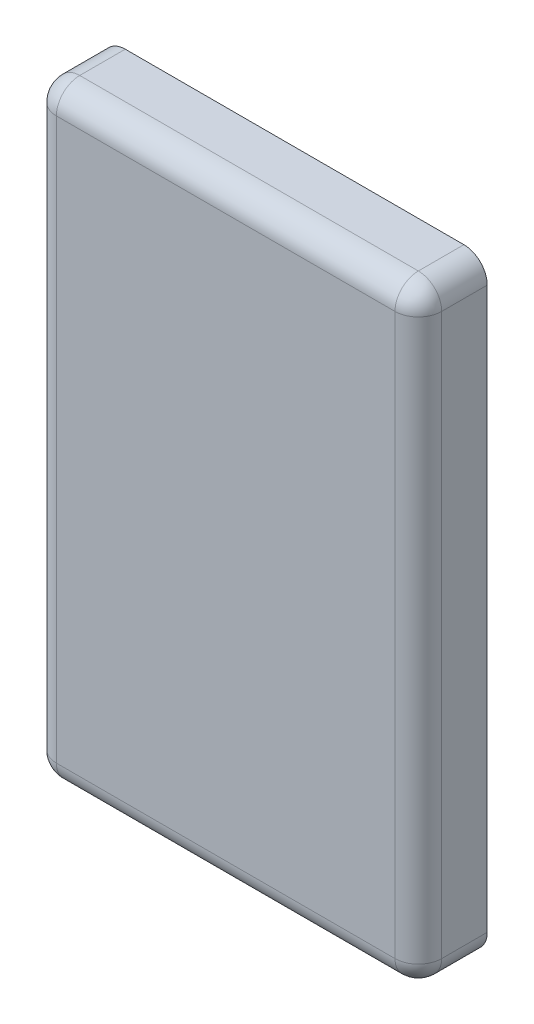
ISO-10303-21;
HEADER;
FILE_DESCRIPTION(('STEP AP214'),'2;1');
FILE_NAME('part.step','',(''),(''),'','','');
FILE_SCHEMA(('AUTOMOTIVE_DESIGN { 1 0 10303 214 1 1 1 1 }'));
ENDSEC;
DATA;
#1=APPLICATION_CONTEXT('core data for automotive mechanical design processes');
#2=APPLICATION_PROTOCOL_DEFINITION('international standard','automotive_design',2000,#1);
#3=PRODUCT_CONTEXT('',#1,'mechanical');
#4=PRODUCT('Part','Part','',(#3));
#5=PRODUCT_RELATED_PRODUCT_CATEGORY('part','',(#4));
#6=PRODUCT_DEFINITION_FORMATION('','',#4);
#7=PRODUCT_DEFINITION_CONTEXT('part definition',#1,'design');
#8=PRODUCT_DEFINITION('design','',#6,#7);
#9=PRODUCT_DEFINITION_SHAPE('','',#8);
#10=(LENGTH_UNIT() NAMED_UNIT(*) SI_UNIT(.MILLI.,.METRE.));
#11=(NAMED_UNIT(*) PLANE_ANGLE_UNIT() SI_UNIT($,.RADIAN.));
#12=(NAMED_UNIT(*) SI_UNIT($,.STERADIAN.) SOLID_ANGLE_UNIT());
#13=UNCERTAINTY_MEASURE_WITH_UNIT(LENGTH_MEASURE(1.E-05),#10,'distance_accuracy_value','');
#14=(GEOMETRIC_REPRESENTATION_CONTEXT(3) GLOBAL_UNCERTAINTY_ASSIGNED_CONTEXT((#13)) GLOBAL_UNIT_ASSIGNED_CONTEXT((#10,
#11,#12)) REPRESENTATION_CONTEXT('',''));
#15=CARTESIAN_POINT('',(0.,0.,0.));
#16=DIRECTION('',(0.,0.,1.));
#17=DIRECTION('',(1.,0.,0.));
#18=AXIS2_PLACEMENT_3D('',#15,#16,#17);
#19=CARTESIAN_POINT('',(165.,260.,9.));
#20=DIRECTION('',(0.,-1.,0.));
#21=DIRECTION('',(0.,0.,-1.));
#22=AXIS2_PLACEMENT_3D('',#19,#20,#21);
#23=PLANE('',#22);
#24=DIRECTION('',(-1.,0.,0.));
#25=VECTOR('',#24,1.);
#26=CARTESIAN_POINT('',(165.,260.,0.));
#27=LINE('',#26,#25);
#28=CARTESIAN_POINT('',(145.,260.,0.));
#29=VERTEX_POINT('',#28);
#30=CARTESIAN_POINT('',(-145.,260.,0.));
#31=VERTEX_POINT('',#30);
#32=EDGE_CURVE('E149',#29,#31,#27,.T.);
#33=ORIENTED_EDGE('',*,*,#32,.T.);
#34=DIRECTION('',(0.,0.,-1.));
#35=VECTOR('',#34,1.);
#36=CARTESIAN_POINT('',(-145.,260.,9.));
#37=LINE('',#36,#35);
#38=CARTESIAN_POINT('',(-145.,260.,39.));
#39=VERTEX_POINT('',#38);
#40=EDGE_CURVE('E170',#31,#39,#37,.F.);
#41=ORIENTED_EDGE('',*,*,#40,.T.);
#42=DIRECTION('',(-1.,0.,0.));
#43=VECTOR('',#42,1.);
#44=CARTESIAN_POINT('',(165.,260.,39.));
#45=LINE('',#44,#43);
#46=CARTESIAN_POINT('',(145.,260.,39.));
#47=VERTEX_POINT('',#46);
#48=EDGE_CURVE('E164',#39,#47,#45,.F.);
#49=ORIENTED_EDGE('',*,*,#48,.T.);
#50=DIRECTION('',(0.,0.,-1.));
#51=VECTOR('',#50,1.);
#52=CARTESIAN_POINT('',(145.,260.,9.));
#53=LINE('',#52,#51);
#54=EDGE_CURVE('E162',#47,#29,#53,.T.);
#55=ORIENTED_EDGE('',*,*,#54,.T.);
#56=EDGE_LOOP('',(#33,#41,#49,#55));
#57=FACE_BOUND('',#56,.T.);
#58=ADVANCED_FACE('F41',(#57),#23,.F.);
#59=CARTESIAN_POINT('',(-165.,-260.,9.));
#60=DIRECTION('',(1.,0.,0.));
#61=DIRECTION('',(0.,0.,-1.));
#62=AXIS2_PLACEMENT_3D('',#59,#60,#61);
#63=PLANE('',#62);
#64=DIRECTION('',(0.,-1.,0.));
#65=VECTOR('',#64,1.);
#66=CARTESIAN_POINT('',(-165.,-260.,0.));
#67=LINE('',#66,#65);
#68=CARTESIAN_POINT('',(-165.,240.,0.));
#69=VERTEX_POINT('',#68);
#70=CARTESIAN_POINT('',(-165.,-240.,0.));
#71=VERTEX_POINT('',#70);
#72=EDGE_CURVE('E144',#69,#71,#67,.T.);
#73=ORIENTED_EDGE('',*,*,#72,.T.);
#74=DIRECTION('',(0.,0.,-1.));
#75=VECTOR('',#74,1.);
#76=CARTESIAN_POINT('',(-165.,-240.,9.));
#77=LINE('',#76,#75);
#78=CARTESIAN_POINT('',(-165.,-240.,39.));
#79=VERTEX_POINT('',#78);
#80=EDGE_CURVE('E121',#71,#79,#77,.F.);
#81=ORIENTED_EDGE('',*,*,#80,.T.);
#82=DIRECTION('',(0.,-1.,0.));
#83=VECTOR('',#82,1.);
#84=CARTESIAN_POINT('',(-165.,260.,39.));
#85=LINE('',#84,#83);
#86=CARTESIAN_POINT('',(-165.,240.,39.));
#87=VERTEX_POINT('',#86);
#88=EDGE_CURVE('E126',#79,#87,#85,.F.);
#89=ORIENTED_EDGE('',*,*,#88,.T.);
#90=DIRECTION('',(0.,0.,-1.));
#91=VECTOR('',#90,1.);
#92=CARTESIAN_POINT('',(-165.,240.,9.));
#93=LINE('',#92,#91);
#94=EDGE_CURVE('E159',#87,#69,#93,.T.);
#95=ORIENTED_EDGE('',*,*,#94,.T.);
#96=EDGE_LOOP('',(#73,#81,#89,#95));
#97=FACE_BOUND('',#96,.T.);
#98=ADVANCED_FACE('F258',(#97),#63,.F.);
#99=CARTESIAN_POINT('',(165.,-260.,9.));
#100=DIRECTION('',(0.,1.,0.));
#101=DIRECTION('',(0.,0.,1.));
#102=AXIS2_PLACEMENT_3D('',#99,#100,#101);
#103=PLANE('',#102);
#104=DIRECTION('',(1.,0.,0.));
#105=VECTOR('',#104,1.);
#106=CARTESIAN_POINT('',(-165.,-260.,39.));
#107=LINE('',#106,#105);
#108=CARTESIAN_POINT('',(145.,-260.,39.));
#109=VERTEX_POINT('',#108);
#110=CARTESIAN_POINT('',(-145.,-260.,39.));
#111=VERTEX_POINT('',#110);
#112=EDGE_CURVE('E140',#109,#111,#107,.F.);
#113=ORIENTED_EDGE('',*,*,#112,.T.);
#114=DIRECTION('',(0.,0.,-1.));
#115=VECTOR('',#114,1.);
#116=CARTESIAN_POINT('',(-145.,-260.,9.));
#117=LINE('',#116,#115);
#118=CARTESIAN_POINT('',(-145.,-260.,0.));
#119=VERTEX_POINT('',#118);
#120=EDGE_CURVE('E125',#111,#119,#117,.T.);
#121=ORIENTED_EDGE('',*,*,#120,.T.);
#122=DIRECTION('',(1.,0.,0.));
#123=VECTOR('',#122,1.);
#124=CARTESIAN_POINT('',(165.,-260.,0.));
#125=LINE('',#124,#123);
#126=CARTESIAN_POINT('',(145.,-260.,0.));
#127=VERTEX_POINT('',#126);
#128=EDGE_CURVE('E135',#119,#127,#125,.T.);
#129=ORIENTED_EDGE('',*,*,#128,.T.);
#130=DIRECTION('',(0.,0.,-1.));
#131=VECTOR('',#130,1.);
#132=CARTESIAN_POINT('',(145.,-260.,9.));
#133=LINE('',#132,#131);
#134=EDGE_CURVE('E150',#127,#109,#133,.F.);
#135=ORIENTED_EDGE('',*,*,#134,.T.);
#136=EDGE_LOOP('',(#113,#121,#129,#135));
#137=FACE_BOUND('',#136,.T.);
#138=ADVANCED_FACE('F132',(#137),#103,.F.);
#139=CARTESIAN_POINT('',(165.,-260.,9.));
#140=DIRECTION('',(-1.,0.,0.));
#141=DIRECTION('',(0.,0.,1.));
#142=AXIS2_PLACEMENT_3D('',#139,#140,#141);
#143=PLANE('',#142);
#144=DIRECTION('',(0.,1.,0.));
#145=VECTOR('',#144,1.);
#146=CARTESIAN_POINT('',(165.,-260.,0.));
#147=LINE('',#146,#145);
#148=CARTESIAN_POINT('',(165.,-240.,0.));
#149=VERTEX_POINT('',#148);
#150=CARTESIAN_POINT('',(165.,240.,0.));
#151=VERTEX_POINT('',#150);
#152=EDGE_CURVE('E145',#149,#151,#147,.T.);
#153=ORIENTED_EDGE('',*,*,#152,.T.);
#154=DIRECTION('',(0.,0.,-1.));
#155=VECTOR('',#154,1.);
#156=CARTESIAN_POINT('',(165.,240.,9.));
#157=LINE('',#156,#155);
#158=CARTESIAN_POINT('',(165.,240.,39.));
#159=VERTEX_POINT('',#158);
#160=EDGE_CURVE('E11',#151,#159,#157,.F.);
#161=ORIENTED_EDGE('',*,*,#160,.T.);
#162=DIRECTION('',(0.,1.,0.));
#163=VECTOR('',#162,1.);
#164=CARTESIAN_POINT('',(165.,-260.,39.));
#165=LINE('',#164,#163);
#166=CARTESIAN_POINT('',(165.,-240.,39.));
#167=VERTEX_POINT('',#166);
#168=EDGE_CURVE('E60',#159,#167,#165,.F.);
#169=ORIENTED_EDGE('',*,*,#168,.T.);
#170=DIRECTION('',(0.,0.,-1.));
#171=VECTOR('',#170,1.);
#172=CARTESIAN_POINT('',(165.,-240.,9.));
#173=LINE('',#172,#171);
#174=EDGE_CURVE('E49',#167,#149,#173,.T.);
#175=ORIENTED_EDGE('',*,*,#174,.T.);
#176=EDGE_LOOP('',(#153,#161,#169,#175));
#177=FACE_BOUND('',#176,.T.);
#178=ADVANCED_FACE('F232',(#177),#143,.F.);
#179=CARTESIAN_POINT('',(0.,0.,0.));
#180=DIRECTION('',(0.,0.,-1.));
#181=DIRECTION('',(-1.,0.,0.));
#182=AXIS2_PLACEMENT_3D('',#179,#180,#181);
#183=PLANE('',#182);
#184=ORIENTED_EDGE('',*,*,#128,.F.);
#185=CARTESIAN_POINT('',(-145.,-240.,0.));
#186=DIRECTION('',(0.,0.,-1.));
#187=DIRECTION('',(-1.,0.,0.));
#188=AXIS2_PLACEMENT_3D('',#185,#186,#187);
#189=CIRCLE('',#188,20.);
#190=EDGE_CURVE('E117',#119,#71,#189,.T.);
#191=ORIENTED_EDGE('',*,*,#190,.T.);
#192=ORIENTED_EDGE('',*,*,#72,.F.);
#193=CARTESIAN_POINT('',(-145.,240.,0.));
#194=DIRECTION('',(0.,0.,-1.));
#195=DIRECTION('',(-1.,0.,0.));
#196=AXIS2_PLACEMENT_3D('',#193,#194,#195);
#197=CIRCLE('',#196,20.);
#198=EDGE_CURVE('E129',#69,#31,#197,.T.);
#199=ORIENTED_EDGE('',*,*,#198,.T.);
#200=ORIENTED_EDGE('',*,*,#32,.F.);
#201=CARTESIAN_POINT('',(145.,240.,0.));
#202=DIRECTION('',(0.,0.,-1.));
#203=DIRECTION('',(-1.,0.,0.));
#204=AXIS2_PLACEMENT_3D('',#201,#202,#203);
#205=CIRCLE('',#204,20.);
#206=EDGE_CURVE('E156',#29,#151,#205,.T.);
#207=ORIENTED_EDGE('',*,*,#206,.T.);
#208=ORIENTED_EDGE('',*,*,#152,.F.);
#209=CARTESIAN_POINT('',(145.,-240.,0.));
#210=DIRECTION('',(0.,0.,-1.));
#211=DIRECTION('',(-1.,0.,0.));
#212=AXIS2_PLACEMENT_3D('',#209,#210,#211);
#213=CIRCLE('',#212,20.);
#214=EDGE_CURVE('E137',#149,#127,#213,.T.);
#215=ORIENTED_EDGE('',*,*,#214,.T.);
#216=EDGE_LOOP('',(#184,#191,#192,#199,#200,#207,#208,#215));
#217=FACE_BOUND('',#216,.T.);
#218=ADVANCED_FACE('F143',(#217),#183,.T.);
#219=CARTESIAN_POINT('',(0.,0.,59.));
#220=DIRECTION('',(0.,0.,1.));
#221=DIRECTION('',(1.,0.,0.));
#222=AXIS2_PLACEMENT_3D('',#219,#220,#221);
#223=PLANE('',#222);
#224=DIRECTION('',(-1.,0.,0.));
#225=VECTOR('',#224,1.);
#226=CARTESIAN_POINT('',(-165.,240.,59.));
#227=LINE('',#226,#225);
#228=CARTESIAN_POINT('',(145.,240.,59.));
#229=VERTEX_POINT('',#228);
#230=CARTESIAN_POINT('',(-145.,240.,59.));
#231=VERTEX_POINT('',#230);
#232=EDGE_CURVE('E173',#229,#231,#227,.T.);
#233=ORIENTED_EDGE('',*,*,#232,.T.);
#234=DIRECTION('',(0.,-1.,0.));
#235=VECTOR('',#234,1.);
#236=CARTESIAN_POINT('',(-145.,-260.,59.));
#237=LINE('',#236,#235);
#238=CARTESIAN_POINT('',(-145.,-240.,59.));
#239=VERTEX_POINT('',#238);
#240=EDGE_CURVE('E171',#231,#239,#237,.T.);
#241=ORIENTED_EDGE('',*,*,#240,.T.);
#242=DIRECTION('',(1.,0.,0.));
#243=VECTOR('',#242,1.);
#244=CARTESIAN_POINT('',(165.,-240.,59.));
#245=LINE('',#244,#243);
#246=CARTESIAN_POINT('',(145.,-240.,59.));
#247=VERTEX_POINT('',#246);
#248=EDGE_CURVE('E172',#239,#247,#245,.T.);
#249=ORIENTED_EDGE('',*,*,#248,.T.);
#250=DIRECTION('',(0.,1.,0.));
#251=VECTOR('',#250,1.);
#252=CARTESIAN_POINT('',(145.,260.,59.));
#253=LINE('',#252,#251);
#254=EDGE_CURVE('E166',#247,#229,#253,.T.);
#255=ORIENTED_EDGE('',*,*,#254,.T.);
#256=EDGE_LOOP('',(#233,#241,#249,#255));
#257=FACE_BOUND('',#256,.T.);
#258=ADVANCED_FACE('F292',(#257),#223,.T.);
#259=CARTESIAN_POINT('',(145.,240.,9.));
#260=DIRECTION('',(0.,0.,-1.));
#261=DIRECTION('',(-1.,0.,0.));
#262=AXIS2_PLACEMENT_3D('',#259,#260,#261);
#263=CYLINDRICAL_SURFACE('',#262,20.);
#264=CARTESIAN_POINT('',(145.,240.,39.));
#265=DIRECTION('',(0.,0.,1.));
#266=DIRECTION('',(1.,0.,0.));
#267=AXIS2_PLACEMENT_3D('',#264,#265,#266);
#268=CIRCLE('',#267,20.);
#269=EDGE_CURVE('E44',#159,#47,#268,.T.);
#270=ORIENTED_EDGE('',*,*,#269,.F.);
#271=ORIENTED_EDGE('',*,*,#160,.F.);
#272=ORIENTED_EDGE('',*,*,#206,.F.);
#273=ORIENTED_EDGE('',*,*,#54,.F.);
#274=EDGE_LOOP('',(#270,#271,#272,#273));
#275=FACE_BOUND('',#274,.T.);
#276=ADVANCED_FACE('F43',(#275),#263,.T.);
#277=CARTESIAN_POINT('',(145.,240.,39.));
#278=DIRECTION('',(0.,1.,0.));
#279=DIRECTION('',(0.,0.,1.));
#280=AXIS2_PLACEMENT_3D('',#277,#278,#279);
#281=SPHERICAL_SURFACE('',#280,20.);
#282=CARTESIAN_POINT('',(145.,240.,39.));
#283=DIRECTION('',(0.,1.,0.));
#284=DIRECTION('',(0.,0.,1.));
#285=AXIS2_PLACEMENT_3D('',#282,#283,#284);
#286=CIRCLE('',#285,20.);
#287=EDGE_CURVE('E202',#159,#229,#286,.F.);
#288=ORIENTED_EDGE('',*,*,#287,.F.);
#289=ORIENTED_EDGE('',*,*,#269,.T.);
#290=CARTESIAN_POINT('',(145.,240.,39.));
#291=DIRECTION('',(1.,0.,0.));
#292=DIRECTION('',(0.,0.,-1.));
#293=AXIS2_PLACEMENT_3D('',#290,#291,#292);
#294=CIRCLE('',#293,20.);
#295=EDGE_CURVE('E210',#229,#47,#294,.F.);
#296=ORIENTED_EDGE('',*,*,#295,.F.);
#297=EDGE_LOOP('',(#288,#289,#296));
#298=FACE_BOUND('',#297,.T.);
#299=ADVANCED_FACE('F288',(#298),#281,.T.);
#300=CARTESIAN_POINT('',(-145.,240.,9.));
#301=DIRECTION('',(0.,0.,-1.));
#302=DIRECTION('',(-1.,0.,0.));
#303=AXIS2_PLACEMENT_3D('',#300,#301,#302);
#304=CYLINDRICAL_SURFACE('',#303,20.);
#305=ORIENTED_EDGE('',*,*,#198,.F.);
#306=ORIENTED_EDGE('',*,*,#94,.F.);
#307=CARTESIAN_POINT('',(-145.,240.,39.));
#308=DIRECTION('',(0.,0.,1.));
#309=DIRECTION('',(1.,0.,0.));
#310=AXIS2_PLACEMENT_3D('',#307,#308,#309);
#311=CIRCLE('',#310,20.);
#312=EDGE_CURVE('E205',#39,#87,#311,.T.);
#313=ORIENTED_EDGE('',*,*,#312,.F.);
#314=ORIENTED_EDGE('',*,*,#40,.F.);
#315=EDGE_LOOP('',(#305,#306,#313,#314));
#316=FACE_BOUND('',#315,.T.);
#317=ADVANCED_FACE('F223',(#316),#304,.T.);
#318=CARTESIAN_POINT('',(0.,240.,39.));
#319=DIRECTION('',(1.,0.,0.));
#320=DIRECTION('',(0.,0.,-1.));
#321=AXIS2_PLACEMENT_3D('',#318,#319,#320);
#322=CYLINDRICAL_SURFACE('',#321,20.);
#323=ORIENTED_EDGE('',*,*,#295,.T.);
#324=ORIENTED_EDGE('',*,*,#48,.F.);
#325=CARTESIAN_POINT('',(-145.,240.,39.));
#326=DIRECTION('',(-1.,0.,0.));
#327=DIRECTION('',(0.,0.,1.));
#328=AXIS2_PLACEMENT_3D('',#325,#326,#327);
#329=CIRCLE('',#328,20.);
#330=EDGE_CURVE('E200',#231,#39,#329,.T.);
#331=ORIENTED_EDGE('',*,*,#330,.F.);
#332=ORIENTED_EDGE('',*,*,#232,.F.);
#333=EDGE_LOOP('',(#323,#324,#331,#332));
#334=FACE_BOUND('',#333,.T.);
#335=ADVANCED_FACE('F235',(#334),#322,.T.);
#336=CARTESIAN_POINT('',(145.,0.,39.));
#337=DIRECTION('',(0.,-1.,0.));
#338=DIRECTION('',(0.,0.,-1.));
#339=AXIS2_PLACEMENT_3D('',#336,#337,#338);
#340=CYLINDRICAL_SURFACE('',#339,20.);
#341=ORIENTED_EDGE('',*,*,#287,.T.);
#342=ORIENTED_EDGE('',*,*,#254,.F.);
#343=CARTESIAN_POINT('',(145.,-240.,39.));
#344=DIRECTION('',(0.,-1.,0.));
#345=DIRECTION('',(0.,0.,-1.));
#346=AXIS2_PLACEMENT_3D('',#343,#344,#345);
#347=CIRCLE('',#346,20.);
#348=EDGE_CURVE('E198',#167,#247,#347,.T.);
#349=ORIENTED_EDGE('',*,*,#348,.F.);
#350=ORIENTED_EDGE('',*,*,#168,.F.);
#351=EDGE_LOOP('',(#341,#342,#349,#350));
#352=FACE_BOUND('',#351,.T.);
#353=ADVANCED_FACE('F244',(#352),#340,.T.);
#354=CARTESIAN_POINT('',(145.,-240.,9.));
#355=DIRECTION('',(0.,0.,-1.));
#356=DIRECTION('',(-1.,0.,0.));
#357=AXIS2_PLACEMENT_3D('',#354,#355,#356);
#358=CYLINDRICAL_SURFACE('',#357,20.);
#359=ORIENTED_EDGE('',*,*,#214,.F.);
#360=ORIENTED_EDGE('',*,*,#174,.F.);
#361=CARTESIAN_POINT('',(145.,-240.,39.));
#362=DIRECTION('',(0.,0.,1.));
#363=DIRECTION('',(1.,0.,0.));
#364=AXIS2_PLACEMENT_3D('',#361,#362,#363);
#365=CIRCLE('',#364,20.);
#366=EDGE_CURVE('E191',#109,#167,#365,.T.);
#367=ORIENTED_EDGE('',*,*,#366,.F.);
#368=ORIENTED_EDGE('',*,*,#134,.F.);
#369=EDGE_LOOP('',(#359,#360,#367,#368));
#370=FACE_BOUND('',#369,.T.);
#371=ADVANCED_FACE('F236',(#370),#358,.T.);
#372=CARTESIAN_POINT('',(-145.,240.,39.));
#373=DIRECTION('',(0.,1.,0.));
#374=DIRECTION('',(0.,0.,1.));
#375=AXIS2_PLACEMENT_3D('',#372,#373,#374);
#376=SPHERICAL_SURFACE('',#375,20.);
#377=ORIENTED_EDGE('',*,*,#330,.T.);
#378=ORIENTED_EDGE('',*,*,#312,.T.);
#379=CARTESIAN_POINT('',(-145.,240.,39.));
#380=DIRECTION('',(0.,1.,0.));
#381=DIRECTION('',(0.,0.,1.));
#382=AXIS2_PLACEMENT_3D('',#379,#380,#381);
#383=CIRCLE('',#382,20.);
#384=EDGE_CURVE('E186',#231,#87,#383,.F.);
#385=ORIENTED_EDGE('',*,*,#384,.F.);
#386=EDGE_LOOP('',(#377,#378,#385));
#387=FACE_BOUND('',#386,.T.);
#388=ADVANCED_FACE('F226',(#387),#376,.T.);
#389=CARTESIAN_POINT('',(145.,-240.,39.));
#390=DIRECTION('',(1.,0.,0.));
#391=DIRECTION('',(0.,0.,-1.));
#392=AXIS2_PLACEMENT_3D('',#389,#390,#391);
#393=SPHERICAL_SURFACE('',#392,20.);
#394=ORIENTED_EDGE('',*,*,#366,.T.);
#395=ORIENTED_EDGE('',*,*,#348,.T.);
#396=CARTESIAN_POINT('',(145.,-240.,39.));
#397=DIRECTION('',(1.,0.,0.));
#398=DIRECTION('',(0.,0.,-1.));
#399=AXIS2_PLACEMENT_3D('',#396,#397,#398);
#400=CIRCLE('',#399,20.);
#401=EDGE_CURVE('E189',#109,#247,#400,.F.);
#402=ORIENTED_EDGE('',*,*,#401,.F.);
#403=EDGE_LOOP('',(#394,#395,#402));
#404=FACE_BOUND('',#403,.T.);
#405=ADVANCED_FACE('F245',(#404),#393,.T.);
#406=CARTESIAN_POINT('',(-145.,0.,39.));
#407=DIRECTION('',(0.,1.,0.));
#408=DIRECTION('',(0.,0.,1.));
#409=AXIS2_PLACEMENT_3D('',#406,#407,#408);
#410=CYLINDRICAL_SURFACE('',#409,20.);
#411=ORIENTED_EDGE('',*,*,#384,.T.);
#412=ORIENTED_EDGE('',*,*,#88,.F.);
#413=CARTESIAN_POINT('',(-145.,-240.,39.));
#414=DIRECTION('',(0.,-1.,0.));
#415=DIRECTION('',(0.,0.,-1.));
#416=AXIS2_PLACEMENT_3D('',#413,#414,#415);
#417=CIRCLE('',#416,20.);
#418=EDGE_CURVE('E184',#239,#79,#417,.T.);
#419=ORIENTED_EDGE('',*,*,#418,.F.);
#420=ORIENTED_EDGE('',*,*,#240,.F.);
#421=EDGE_LOOP('',(#411,#412,#419,#420));
#422=FACE_BOUND('',#421,.T.);
#423=ADVANCED_FACE('F255',(#422),#410,.T.);
#424=CARTESIAN_POINT('',(0.,-240.,39.));
#425=DIRECTION('',(-1.,0.,0.));
#426=DIRECTION('',(0.,0.,1.));
#427=AXIS2_PLACEMENT_3D('',#424,#425,#426);
#428=CYLINDRICAL_SURFACE('',#427,20.);
#429=ORIENTED_EDGE('',*,*,#401,.T.);
#430=ORIENTED_EDGE('',*,*,#248,.F.);
#431=CARTESIAN_POINT('',(-145.,-240.,39.));
#432=DIRECTION('',(-1.,0.,0.));
#433=DIRECTION('',(0.,0.,1.));
#434=AXIS2_PLACEMENT_3D('',#431,#432,#433);
#435=CIRCLE('',#434,20.);
#436=EDGE_CURVE('E185',#111,#239,#435,.T.);
#437=ORIENTED_EDGE('',*,*,#436,.F.);
#438=ORIENTED_EDGE('',*,*,#112,.F.);
#439=EDGE_LOOP('',(#429,#430,#437,#438));
#440=FACE_BOUND('',#439,.T.);
#441=ADVANCED_FACE('F250',(#440),#428,.T.);
#442=CARTESIAN_POINT('',(-145.,-240.,39.));
#443=DIRECTION('',(0.,0.,1.));
#444=DIRECTION('',(1.,0.,0.));
#445=AXIS2_PLACEMENT_3D('',#442,#443,#444);
#446=SPHERICAL_SURFACE('',#445,20.);
#447=ORIENTED_EDGE('',*,*,#436,.T.);
#448=ORIENTED_EDGE('',*,*,#418,.T.);
#449=CARTESIAN_POINT('',(-145.,-240.,39.));
#450=DIRECTION('',(0.,0.,1.));
#451=DIRECTION('',(1.,0.,0.));
#452=AXIS2_PLACEMENT_3D('',#449,#450,#451);
#453=CIRCLE('',#452,20.);
#454=EDGE_CURVE('E179',#111,#79,#453,.F.);
#455=ORIENTED_EDGE('',*,*,#454,.F.);
#456=EDGE_LOOP('',(#447,#448,#455));
#457=FACE_BOUND('',#456,.T.);
#458=ADVANCED_FACE('F253',(#457),#446,.T.);
#459=CARTESIAN_POINT('',(-145.,-240.,9.));
#460=DIRECTION('',(0.,0.,-1.));
#461=DIRECTION('',(-1.,0.,0.));
#462=AXIS2_PLACEMENT_3D('',#459,#460,#461);
#463=CYLINDRICAL_SURFACE('',#462,20.);
#464=ORIENTED_EDGE('',*,*,#454,.T.);
#465=ORIENTED_EDGE('',*,*,#80,.F.);
#466=ORIENTED_EDGE('',*,*,#190,.F.);
#467=ORIENTED_EDGE('',*,*,#120,.F.);
#468=EDGE_LOOP('',(#464,#465,#466,#467));
#469=FACE_BOUND('',#468,.T.);
#470=ADVANCED_FACE('F123',(#469),#463,.T.);
#471=CLOSED_SHELL('',(#58,#98,#138,#178,#218,#258,#276,#299,#317,#335,#353,#371,#388,#405,#423,
#441,#458,#470));
#472=MANIFOLD_SOLID_BREP('B2',#471);
#473=ADVANCED_BREP_SHAPE_REPRESENTATION('',(#18,#472),#14);
#474=SHAPE_DEFINITION_REPRESENTATION(#9,#473);
ENDSEC;
END-ISO-10303-21;
